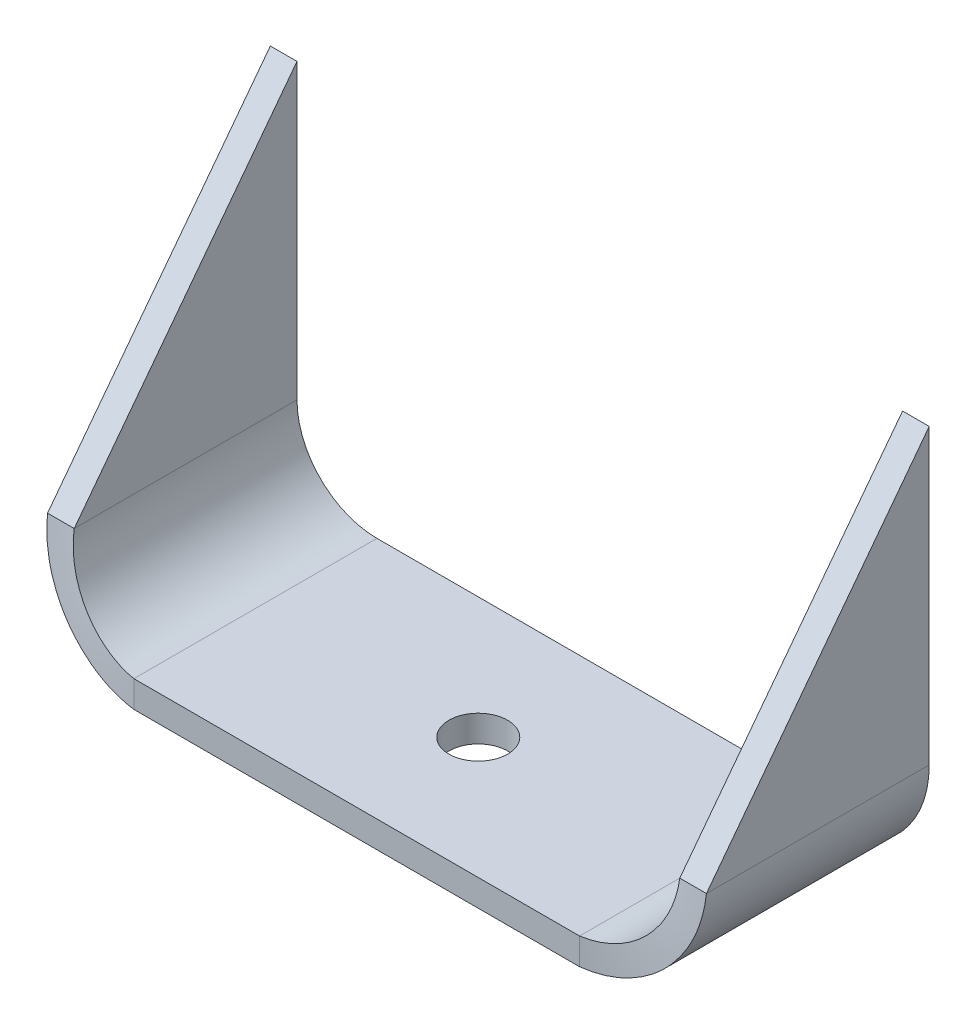
ISO-10303-21;
HEADER;
FILE_DESCRIPTION(('STEP AP214'),'2;1');
FILE_NAME('part.step','',(''),(''),'','','');
FILE_SCHEMA(('AUTOMOTIVE_DESIGN { 1 0 10303 214 1 1 1 1 }'));
ENDSEC;
DATA;
#1=APPLICATION_CONTEXT('core data for automotive mechanical design processes');
#2=APPLICATION_PROTOCOL_DEFINITION('international standard','automotive_design',2000,#1);
#3=PRODUCT_CONTEXT('',#1,'mechanical');
#4=PRODUCT('Part','Part','',(#3));
#5=PRODUCT_RELATED_PRODUCT_CATEGORY('part','',(#4));
#6=PRODUCT_DEFINITION_FORMATION('','',#4);
#7=PRODUCT_DEFINITION_CONTEXT('part definition',#1,'design');
#8=PRODUCT_DEFINITION('design','',#6,#7);
#9=PRODUCT_DEFINITION_SHAPE('','',#8);
#10=(LENGTH_UNIT() NAMED_UNIT(*) SI_UNIT(.MILLI.,.METRE.));
#11=(NAMED_UNIT(*) PLANE_ANGLE_UNIT() SI_UNIT($,.RADIAN.));
#12=(NAMED_UNIT(*) SI_UNIT($,.STERADIAN.) SOLID_ANGLE_UNIT());
#13=UNCERTAINTY_MEASURE_WITH_UNIT(LENGTH_MEASURE(1.E-05),#10,'distance_accuracy_value','');
#14=(GEOMETRIC_REPRESENTATION_CONTEXT(3) GLOBAL_UNCERTAINTY_ASSIGNED_CONTEXT((#13)) GLOBAL_UNIT_ASSIGNED_CONTEXT((#10,
#11,#12)) REPRESENTATION_CONTEXT('',''));
#15=CARTESIAN_POINT('',(0.,0.,0.));
#16=DIRECTION('',(0.,0.,1.));
#17=DIRECTION('',(1.,0.,0.));
#18=AXIS2_PLACEMENT_3D('',#15,#16,#17);
#19=CARTESIAN_POINT('',(0.,-3.175,-28.956));
#20=DIRECTION('',(0.,0.,-1.));
#21=DIRECTION('',(-1.,0.,0.));
#22=AXIS2_PLACEMENT_3D('',#19,#20,#21);
#23=PLANE('',#22);
#24=DIRECTION('',(-1.,0.,0.));
#25=VECTOR('',#24,1.);
#26=CARTESIAN_POINT('',(0.,0.,-28.956));
#27=LINE('',#26,#25);
#28=CARTESIAN_POINT('',(53.099999972,0.,-28.956));
#29=VERTEX_POINT('',#28);
#30=CARTESIAN_POINT('',(0.,0.,-28.956));
#31=VERTEX_POINT('',#30);
#32=EDGE_CURVE('E113',#29,#31,#27,.T.);
#33=ORIENTED_EDGE('',*,*,#32,.F.);
#34=DIRECTION('',(0.,1.,0.));
#35=VECTOR('',#34,1.);
#36=CARTESIAN_POINT('',(53.099999972,-3.175,-28.956));
#37=LINE('',#36,#35);
#38=CARTESIAN_POINT('',(53.099999972,-3.175,-28.956));
#39=VERTEX_POINT('',#38);
#40=EDGE_CURVE('E81',#39,#29,#37,.T.);
#41=ORIENTED_EDGE('',*,*,#40,.F.);
#42=DIRECTION('',(-1.,0.,0.));
#43=VECTOR('',#42,1.);
#44=CARTESIAN_POINT('',(0.,-3.175,-28.956));
#45=LINE('',#44,#43);
#46=CARTESIAN_POINT('',(0.,-3.175,-28.956));
#47=VERTEX_POINT('',#46);
#48=EDGE_CURVE('E115',#39,#47,#45,.T.);
#49=ORIENTED_EDGE('',*,*,#48,.T.);
#50=DIRECTION('',(0.,1.,0.));
#51=VECTOR('',#50,1.);
#52=CARTESIAN_POINT('',(0.,-3.175,-28.956));
#53=LINE('',#52,#51);
#54=EDGE_CURVE('E13',#47,#31,#53,.T.);
#55=ORIENTED_EDGE('',*,*,#54,.T.);
#56=EDGE_LOOP('',(#33,#41,#49,#55));
#57=FACE_BOUND('',#56,.T.);
#58=ADVANCED_FACE('F71',(#57),#23,.T.);
#59=CARTESIAN_POINT('',(0.,-3.175,0.));
#60=DIRECTION('',(0.,0.,1.));
#61=DIRECTION('',(1.,0.,0.));
#62=AXIS2_PLACEMENT_3D('',#59,#60,#61);
#63=PLANE('',#62);
#64=DIRECTION('',(1.,0.,0.));
#65=VECTOR('',#64,1.);
#66=CARTESIAN_POINT('',(0.,0.,0.));
#67=LINE('',#66,#65);
#68=CARTESIAN_POINT('',(0.,0.,0.));
#69=VERTEX_POINT('',#68);
#70=CARTESIAN_POINT('',(53.099999972,0.,0.));
#71=VERTEX_POINT('',#70);
#72=EDGE_CURVE('E136',#69,#71,#67,.T.);
#73=ORIENTED_EDGE('',*,*,#72,.F.);
#74=DIRECTION('',(0.,1.,0.));
#75=VECTOR('',#74,1.);
#76=CARTESIAN_POINT('',(0.,-3.175,0.));
#77=LINE('',#76,#75);
#78=CARTESIAN_POINT('',(0.,-3.175,0.));
#79=VERTEX_POINT('',#78);
#80=EDGE_CURVE('E75',#79,#69,#77,.T.);
#81=ORIENTED_EDGE('',*,*,#80,.F.);
#82=DIRECTION('',(1.,0.,0.));
#83=VECTOR('',#82,1.);
#84=CARTESIAN_POINT('',(0.,-3.175,0.));
#85=LINE('',#84,#83);
#86=CARTESIAN_POINT('',(53.099999972,-3.175,0.));
#87=VERTEX_POINT('',#86);
#88=EDGE_CURVE('E240',#79,#87,#85,.T.);
#89=ORIENTED_EDGE('',*,*,#88,.T.);
#90=DIRECTION('',(0.,1.,0.));
#91=VECTOR('',#90,1.);
#92=CARTESIAN_POINT('',(53.099999972,-3.175,0.));
#93=LINE('',#92,#91);
#94=EDGE_CURVE('E249',#87,#71,#93,.T.);
#95=ORIENTED_EDGE('',*,*,#94,.T.);
#96=EDGE_LOOP('',(#73,#81,#89,#95));
#97=FACE_BOUND('',#96,.T.);
#98=ADVANCED_FACE('F73',(#97),#63,.T.);
#99=CARTESIAN_POINT('',(0.,-3.175,0.));
#100=DIRECTION('',(0.,-1.,0.));
#101=DIRECTION('',(0.,0.,-1.));
#102=AXIS2_PLACEMENT_3D('',#99,#100,#101);
#103=PLANE('',#102);
#104=CARTESIAN_POINT('',(26.549999986,-3.175,-14.478));
#105=DIRECTION('',(0.,1.,0.));
#106=DIRECTION('',(0.,0.,1.));
#107=AXIS2_PLACEMENT_3D('',#104,#105,#106);
#108=CIRCLE('',#107,3.5);
#109=CARTESIAN_POINT('',(26.549999986,-3.175,-10.978));
#110=VERTEX_POINT('',#109);
#111=EDGE_CURVE('E374',#110,#110,#108,.T.);
#112=ORIENTED_EDGE('',*,*,#111,.T.);
#113=EDGE_LOOP('',(#112));
#114=FACE_BOUND('',#113,.T.);
#115=DIRECTION('',(0.,0.,1.));
#116=VECTOR('',#115,1.);
#117=CARTESIAN_POINT('',(0.,-3.175,0.));
#118=LINE('',#117,#116);
#119=EDGE_CURVE('E90',#47,#79,#118,.T.);
#120=ORIENTED_EDGE('',*,*,#119,.F.);
#121=ORIENTED_EDGE('',*,*,#48,.F.);
#122=DIRECTION('',(0.,0.,-1.));
#123=VECTOR('',#122,1.);
#124=CARTESIAN_POINT('',(53.099999972,-3.175,0.));
#125=LINE('',#124,#123);
#126=EDGE_CURVE('E243',#87,#39,#125,.T.);
#127=ORIENTED_EDGE('',*,*,#126,.F.);
#128=ORIENTED_EDGE('',*,*,#88,.F.);
#129=EDGE_LOOP('',(#120,#121,#127,#128));
#130=FACE_BOUND('',#129,.T.);
#131=ADVANCED_FACE('F193',(#114,#130),#103,.T.);
#132=CARTESIAN_POINT('',(0.,0.,0.));
#133=DIRECTION('',(0.,-1.,0.));
#134=DIRECTION('',(0.,0.,-1.));
#135=AXIS2_PLACEMENT_3D('',#132,#133,#134);
#136=PLANE('',#135);
#137=CARTESIAN_POINT('',(26.549999986,0.,-14.478));
#138=DIRECTION('',(0.,1.,0.));
#139=DIRECTION('',(0.,0.,1.));
#140=AXIS2_PLACEMENT_3D('',#137,#138,#139);
#141=CIRCLE('',#140,3.49999999999999);
#142=CARTESIAN_POINT('',(26.549999986,0.,-10.978));
#143=VERTEX_POINT('',#142);
#144=EDGE_CURVE('E376',#143,#143,#141,.T.);
#145=ORIENTED_EDGE('',*,*,#144,.F.);
#146=EDGE_LOOP('',(#145));
#147=FACE_BOUND('',#146,.T.);
#148=DIRECTION('',(0.,0.,1.));
#149=VECTOR('',#148,1.);
#150=CARTESIAN_POINT('',(0.,0.,0.));
#151=LINE('',#150,#149);
#152=EDGE_CURVE('E123',#31,#69,#151,.T.);
#153=ORIENTED_EDGE('',*,*,#152,.T.);
#154=ORIENTED_EDGE('',*,*,#72,.T.);
#155=DIRECTION('',(0.,0.,-1.));
#156=VECTOR('',#155,1.);
#157=CARTESIAN_POINT('',(53.099999972,0.,0.));
#158=LINE('',#157,#156);
#159=EDGE_CURVE('E108',#71,#29,#158,.T.);
#160=ORIENTED_EDGE('',*,*,#159,.T.);
#161=ORIENTED_EDGE('',*,*,#32,.T.);
#162=EDGE_LOOP('',(#153,#154,#160,#161));
#163=FACE_BOUND('',#162,.T.);
#164=ADVANCED_FACE('F122',(#147,#163),#136,.F.);
#165=CARTESIAN_POINT('',(53.099999972,-3.20675,0.));
#166=CARTESIAN_POINT('',(54.7668783217408,-3.20675,-0.201119069286974));
#167=CARTESIAN_POINT('',(56.4325085986912,-2.87537662617183,-0.402166666666662));
#168=CARTESIAN_POINT('',(59.5119509253372,-1.59982984992933,-0.804333333333324));
#169=CARTESIAN_POINT('',(60.9242551740406,-0.656158320703046,-1.00541666666665));
#170=CARTESIAN_POINT('',(63.281158292703,1.70074479795935,-1.40758333333332));
#171=CARTESIAN_POINT('',(64.2248298219293,3.11304904666277,-1.60866666666665));
#172=CARTESIAN_POINT('',(65.5003765981718,6.1924913733087,-2.01083333333331));
#173=CARTESIAN_POINT('',(65.831749972,7.85812165025914,-2.211880930713));
#174=CARTESIAN_POINT('',(65.831749972,9.52499999999995,-2.41299999999997));
#175=CARTESIAN_POINT('',(53.099999972,-3.175,0.));
#176=CARTESIAN_POINT('',(54.7627214933645,-3.175,-0.201119065323934));
#177=CARTESIAN_POINT('',(56.4241981033628,-2.84445299368761,-0.402166666666662));
#178=CARTESIAN_POINT('',(59.4959610227104,-1.57208713209909,-0.804333333333324));
#179=CARTESIAN_POINT('',(60.9047433156814,-0.630768898456903,-1.00541666666665));
#180=CARTESIAN_POINT('',(63.2557688704569,1.72025665631856,-1.40758333333332));
#181=CARTESIAN_POINT('',(64.1970871040991,3.12903894928955,-1.60866666666665));
#182=CARTESIAN_POINT('',(65.4694529656876,6.2008018686371,-2.01083333333331));
#183=CARTESIAN_POINT('',(65.799999972,7.86227847863543,-2.21188093467604));
#184=CARTESIAN_POINT('',(65.799999972,9.52499999999995,-2.41299999999997));
#185=CARTESIAN_POINT('',(53.099999972,0.,0.));
#186=CARTESIAN_POINT('',(54.3470386557356,0.,-0.201118669019911));
#187=CARTESIAN_POINT('',(55.5931485705221,0.247910254734289,-0.402166666666662));
#188=CARTESIAN_POINT('',(57.8969707600328,1.20218465092568,-0.804333333333324));
#189=CARTESIAN_POINT('',(58.953557479761,1.90817332615732,-1.00541666666665));
#190=CARTESIAN_POINT('',(60.7168266458427,3.67144249223892,-1.40758333333332));
#191=CARTESIAN_POINT('',(61.4228153210743,4.72802921196716,-1.60866666666665));
#192=CARTESIAN_POINT('',(62.3770897172657,7.03185140147783,-2.01083333333331));
#193=CARTESIAN_POINT('',(62.624999972,8.27796131626434,-2.21188133098006));
#194=CARTESIAN_POINT('',(62.624999972,9.52499999999996,-2.41299999999997));
#195=CARTESIAN_POINT('',(53.099999972,0.0320674999999965,0.));
#196=CARTESIAN_POINT('',(54.3428402590756,0.0320674999999964,-0.20111866501724));
#197=CARTESIAN_POINT('',(55.5847549702404,0.27914312354335,-0.402166666666662));
#198=CARTESIAN_POINT('',(57.8808209583798,1.23020479593423,-0.804333333333324));
#199=CARTESIAN_POINT('',(58.9338505028182,1.93381664262592,-1.00541666666665));
#200=CARTESIAN_POINT('',(60.691183329374,3.69114946918171,-1.40758333333332));
#201=CARTESIAN_POINT('',(61.3947951760657,4.7441790136202,-1.60866666666665));
#202=CARTESIAN_POINT('',(62.3458568484566,7.04024500175952,-2.01083333333331));
#203=CARTESIAN_POINT('',(62.592932472,8.2821597129244,-2.21188133498273));
#204=CARTESIAN_POINT('',(62.592932472,9.52499999999996,-2.41299999999997));
#205=B_SPLINE_SURFACE_WITH_KNOTS('',1,3,((#165,#166,#167,#168,#169,#170,#171,#172,#173,#174),
(#175,#176,#177,#178,#179,#180,#181,#182,#183,#184),(#185,#186,#187,#188,#189,#190,#191,#192,
#193,#194),(#195,#196,#197,#198,#199,#200,#201,#202,#203,#204)),.UNSPECIFIED.,.F.,.F.,.F.,(2,1,
1,2),(4,2,2,2,4),(-0.01,0.,1.,1.0101),(0.,0.25,0.5,0.75,1.),.UNSPECIFIED.);
#206=DIRECTION('',(-1.,0.,0.));
#207=VECTOR('',#206,1.);
#208=CARTESIAN_POINT('',(65.799999972,9.52499999999995,-2.41299999999997));
#209=LINE('',#208,#207);
#210=CARTESIAN_POINT('',(62.624999972,9.52499999999996,-2.41299999999997));
#211=VERTEX_POINT('',#210);
#212=CARTESIAN_POINT('',(65.799999972,9.52499999999995,-2.41299999999997));
#213=VERTEX_POINT('',#212);
#214=EDGE_CURVE('E264',#211,#213,#209,.F.);
#215=CARTESIAN_POINT('',(53.099999972,0.,0.));
#216=CARTESIAN_POINT('',(53.3712999926333,-3.0282621135614E-05,-0.0437561906853781));
#217=CARTESIAN_POINT('',(53.6425957263183,0.0115898621989685,-0.0875116631499076));
#218=CARTESIAN_POINT('',(54.1831968820804,0.0579122984946413,-0.175018553010706));
#219=CARTESIAN_POINT('',(54.4525024019455,0.0926134481698858,-0.218769970500498));
#220=CARTESIAN_POINT('',(54.9869648919899,0.184844068995432,-0.306237119437251));
#221=CARTESIAN_POINT('',(55.2521248673012,0.242356122931786,-0.349952852670426));
#222=CARTESIAN_POINT('',(55.7765711009828,0.379779250222863,-0.437387746101037));
#223=CARTESIAN_POINT('',(56.0358574309864,0.459690050249545,-0.481106906250145));
#224=CARTESIAN_POINT('',(56.5468770506072,0.641404694150914,-0.568580273035358));
#225=CARTESIAN_POINT('',(56.7986040926012,0.74322610850805,-0.612334479555428));
#226=CARTESIAN_POINT('',(57.2924552186447,0.967982640005884,-0.699844670147483));
#227=CARTESIAN_POINT('',(57.5345790984543,1.09091820590589,-0.743600654237484));
#228=CARTESIAN_POINT('',(58.0074048134801,1.35697844705272,-0.83109966178345));
#229=CARTESIAN_POINT('',(58.2381089259176,1.50009907509738,-0.8748426860803));
#230=CARTESIAN_POINT('',(58.6864622642934,1.80550282319842,-0.962329254284162));
#231=CARTESIAN_POINT('',(58.9041115647686,1.96778583383073,-1.00607279818678));
#232=CARTESIAN_POINT('',(59.3247646299521,2.31032748420228,-1.09356264291077));
#233=CARTESIAN_POINT('',(59.5277686900167,2.49058576125258,-1.13730894365873));
#234=CARTESIAN_POINT('',(59.9176560486485,2.86776634636902,-1.22480070751386));
#235=CARTESIAN_POINT('',(60.1045393462315,3.06468865545261,-1.26854617062099));
#236=CARTESIAN_POINT('',(60.4608662614792,3.4738118292412,-1.35604708889815));
#237=CARTESIAN_POINT('',(60.6303055479476,3.6860164662941,-1.39980254385926));
#238=CARTESIAN_POINT('',(60.9504524085507,4.12410884752804,-1.48730929233299));
#239=CARTESIAN_POINT('',(61.1011603185169,4.34999634628343,-1.53106058590616));
#240=CARTESIAN_POINT('',(61.3827851876533,4.81387109680399,-1.61857832421223));
#241=CARTESIAN_POINT('',(61.5136968733552,5.05186155016321,-1.66234476988032));
#242=CARTESIAN_POINT('',(61.7547234026754,5.53814274245009,-1.74987732517462));
#243=CARTESIAN_POINT('',(61.8648386272968,5.78643329257242,-1.79364343479229));
#244=CARTESIAN_POINT('',(62.0634138766957,6.29136754157777,-1.88115198038449));
#245=CARTESIAN_POINT('',(62.1518865229127,6.54800627257886,-1.92489441524196));
#246=CARTESIAN_POINT('',(62.3065907774417,7.06779602997821,-2.01235885457143));
#247=CARTESIAN_POINT('',(62.3728286609904,7.33094519641041,-2.05608086132424));
#248=CARTESIAN_POINT('',(62.4933026484582,7.91369110863582,-2.15204751998587));
#249=CARTESIAN_POINT('',(62.5426976542474,8.23431074710971,-2.20429559706653));
#250=CARTESIAN_POINT('',(62.5920784639714,8.71736848912778,-2.28260829288259));
#251=CARTESIAN_POINT('',(62.6044201066049,8.87863958216343,-2.3086861150697));
#252=CARTESIAN_POINT('',(62.6208803140551,9.20159664576877,-2.36084114049977));
#253=CARTESIAN_POINT('',(62.6249990951739,9.36328260531338,-2.38691834374096));
#254=CARTESIAN_POINT('',(62.624999972,9.52499999999996,-2.41299999999997));
#255=B_SPLINE_CURVE_WITH_KNOTS('',3,(#215,#216,#217,#218,#219,#220,#221,#222,#223,#224,#225,
#226,#227,#228,#229,#230,#231,#232,#233,#234,#235,#236,#237,#238,#239,#240,#241,#242,#243,#244,
#245,#246,#247,#248,#249,#250,#251,#252,#253,#254),.UNSPECIFIED.,.F.,.F.,(4,2,2,2,2,2,2,2,2,2,2,
2,2,2,2,2,2,2,2,4),(0.,0.8241661277999,1.64829148774001,2.47178879629985,3.29527605630133,
4.11942616173549,4.94359378579012,5.76759639457741,6.59159429824171,7.41557557937188,
8.23955691081138,9.06374233873039,9.88791298784274,10.7123028004835,11.5366775083655,
12.360570308149,13.1842303877653,14.1681132071005,14.6594323230379,15.1507385146688),.UNSPECIFIED.);
#256=EDGE_CURVE('E230',#71,#211,#255,.T.);
#257=CARTESIAN_POINT('',(53.099999972,-3.175,0.));
#258=CARTESIAN_POINT('',(53.4598143696205,-3.1750395351196,-0.0435240480951579));
#259=CARTESIAN_POINT('',(53.8196231332415,-3.15971035290083,-0.0870474138938615));
#260=CARTESIAN_POINT('',(54.5366287845854,-3.09860008956019,-0.174090143467927));
#261=CARTESIAN_POINT('',(54.8938257986772,-3.05282049176502,-0.217609507334962));
#262=CARTESIAN_POINT('',(55.6027731264167,-2.9311411835604,-0.304612728824404));
#263=CARTESIAN_POINT('',(55.9545273769736,-2.85526441386736,-0.348096588271414));
#264=CARTESIAN_POINT('',(56.6503276354568,-2.67395102423988,-0.435067694486709));
#265=CARTESIAN_POINT('',(56.9943737385714,-2.56851476955439,-0.478554941206503));
#266=CARTESIAN_POINT('',(57.6724578369761,-2.32877656292204,-0.565551817437175));
#267=CARTESIAN_POINT('',(58.0064905683299,-2.19445972173802,-0.609061446901118));
#268=CARTESIAN_POINT('',(58.6619519097978,-1.89796259982687,-0.69608163733563));
#269=CARTESIAN_POINT('',(58.9833805170782,-1.73578231283558,-0.739592198306405));
#270=CARTESIAN_POINT('',(59.6112573413644,-1.38476010213809,-0.826601186653028));
#271=CARTESIAN_POINT('',(59.9177082890723,-1.19592306304156,-0.870099614792185));
#272=CARTESIAN_POINT('',(60.5134802550246,-0.792928403435308,-0.957096717161467));
#273=CARTESIAN_POINT('',(60.8028013682555,-0.578770923349396,-1.00059539138889));
#274=CARTESIAN_POINT('',(61.3622236320287,-0.126683385581436,-1.08759582039746));
#275=CARTESIAN_POINT('',(61.6323251135153,0.111246262596263,-1.13109757511264));
#276=CARTESIAN_POINT('',(62.1513674544664,0.609166897942846,-1.21810040396436));
#277=CARTESIAN_POINT('',(62.4003081928641,0.869158011314824,-1.26160147809559));
#278=CARTESIAN_POINT('',(62.8752854330261,1.4093863067857,-1.34861294408476));
#279=CARTESIAN_POINT('',(63.1013167547393,1.68962804332754,-1.3921233358307));
#280=CARTESIAN_POINT('',(63.5287767086809,2.26827870266163,-1.47913974736263));
#281=CARTESIAN_POINT('',(63.7302057549113,2.56668731961873,-1.52264576720986));
#282=CARTESIAN_POINT('',(64.107055529204,3.17959433905747,-1.60967107411692));
#283=CARTESIAN_POINT('',(64.2824702172968,3.49409645537308,-1.65319036191434));
#284=CARTESIAN_POINT('',(64.6059696105987,4.13685386284893,-1.74022997698844));
#285=CARTESIAN_POINT('',(64.7540542246498,4.46510919987781,-1.7837503042681));
#286=CARTESIAN_POINT('',(65.0217525277857,5.13283634639929,-1.87076939988641));
#287=CARTESIAN_POINT('',(65.1413815473333,5.4723020035453,-1.91426816717695));
#288=CARTESIAN_POINT('',(65.3513774326387,6.16002596319479,-2.00124576890148));
#289=CARTESIAN_POINT('',(65.4417520269375,6.50828191719467,-2.04472460556485));
#290=CARTESIAN_POINT('',(65.6111751025034,7.29769961753033,-2.14238100576527));
#291=CARTESIAN_POINT('',(65.6819907098931,7.74067267066972,-2.19656359108586));
#292=CARTESIAN_POINT('',(65.7527923609981,8.40833184343949,-2.27777531169699));
#293=CARTESIAN_POINT('',(65.7704892688882,8.63128741182623,-2.3048197959303));
#294=CARTESIAN_POINT('',(65.7940920280174,9.07781259387584,-2.35890777633193));
#295=CARTESIAN_POINT('',(65.7999983673479,9.30138218173662,-2.38595127249479));
#296=CARTESIAN_POINT('',(65.799999972,9.52499999999995,-2.41299999999997));
#297=B_SPLINE_CURVE_WITH_KNOTS('',3,(#257,#258,#259,#260,#261,#262,#263,#264,#265,#266,#267,
#268,#269,#270,#271,#272,#273,#274,#275,#276,#277,#278,#279,#280,#281,#282,#283,#284,#285,#286,
#287,#288,#289,#290,#291,#292,#293,#294,#295,#296),.UNSPECIFIED.,.F.,.F.,(4,2,2,2,2,2,2,2,2,2,2,
2,2,2,2,2,2,2,2,4),(0.,1.08697965280844,2.17390635961131,3.26000617445681,4.34609256960571,
5.43274023928401,6.51938815325865,7.60583720664282,8.69228023500694,9.77870455130149,
10.865135082929,11.9518107220374,13.0384680722732,14.1253773270917,15.2122902071711,
16.2986161794498,17.384654927501,18.7374217285285,19.4130187958131,20.0885878949887),.UNSPECIFIED.);
#298=EDGE_CURVE('E137',#87,#213,#297,.T.);
#299=ORIENTED_EDGE('',*,*,#214,.F.);
#300=ORIENTED_EDGE('',*,*,#256,.F.);
#301=ORIENTED_EDGE('',*,*,#94,.F.);
#302=ORIENTED_EDGE('',*,*,#298,.T.);
#303=EDGE_LOOP('',(#299,#300,#301,#302));
#304=FACE_BOUND('',#303,.T.);
#305=ADVANCED_FACE('F198',(#304),#205,.F.);
#306=CARTESIAN_POINT('',(53.099999972,9.525,-28.956));
#307=DIRECTION('',(0.,0.,1.));
#308=DIRECTION('',(1.,0.,0.));
#309=AXIS2_PLACEMENT_3D('',#306,#307,#308);
#310=PLANE('',#309);
#311=CARTESIAN_POINT('',(53.099999972,9.525,-28.956));
#312=DIRECTION('',(0.,0.,-1.));
#313=DIRECTION('',(-1.,0.,0.));
#314=AXIS2_PLACEMENT_3D('',#311,#312,#313);
#315=CIRCLE('',#314,9.525);
#316=CARTESIAN_POINT('',(62.624999972,9.52499999999996,-28.956));
#317=VERTEX_POINT('',#316);
#318=EDGE_CURVE('E238',#317,#29,#315,.T.);
#319=ORIENTED_EDGE('',*,*,#318,.F.);
#320=DIRECTION('',(-1.,0.,0.));
#321=VECTOR('',#320,1.);
#322=CARTESIAN_POINT('',(62.624999972,9.52499999999996,-28.956));
#323=LINE('',#322,#321);
#324=CARTESIAN_POINT('',(65.799999972,9.52499999999995,-28.956));
#325=VERTEX_POINT('',#324);
#326=EDGE_CURVE('E275',#317,#325,#323,.F.);
#327=ORIENTED_EDGE('',*,*,#326,.T.);
#328=CARTESIAN_POINT('',(53.099999972,9.525,-28.956));
#329=DIRECTION('',(0.,0.,-1.));
#330=DIRECTION('',(-1.,0.,0.));
#331=AXIS2_PLACEMENT_3D('',#328,#329,#330);
#332=CIRCLE('',#331,12.7);
#333=EDGE_CURVE('E237',#325,#39,#332,.T.);
#334=ORIENTED_EDGE('',*,*,#333,.T.);
#335=ORIENTED_EDGE('',*,*,#40,.T.);
#336=EDGE_LOOP('',(#319,#327,#334,#335));
#337=FACE_BOUND('',#336,.T.);
#338=ADVANCED_FACE('F203',(#337),#310,.F.);
#339=CARTESIAN_POINT('',(53.099999972,9.525,-28.956));
#340=DIRECTION('',(0.,0.,-1.));
#341=DIRECTION('',(1.,0.,0.));
#342=AXIS2_PLACEMENT_3D('',#339,#340,#341);
#343=CYLINDRICAL_SURFACE('',#342,12.7);
#344=ORIENTED_EDGE('',*,*,#126,.T.);
#345=ORIENTED_EDGE('',*,*,#333,.F.);
#346=DIRECTION('',(0.,0.,-1.));
#347=VECTOR('',#346,1.);
#348=CARTESIAN_POINT('',(65.799999972,9.52499999999995,-2.41299999999997));
#349=LINE('',#348,#347);
#350=EDGE_CURVE('E299',#325,#213,#349,.F.);
#351=ORIENTED_EDGE('',*,*,#350,.T.);
#352=ORIENTED_EDGE('',*,*,#298,.F.);
#353=EDGE_LOOP('',(#344,#345,#351,#352));
#354=FACE_BOUND('',#353,.T.);
#355=ADVANCED_FACE('F206',(#354),#343,.T.);
#356=CARTESIAN_POINT('',(53.099999972,9.525,-28.956));
#357=DIRECTION('',(0.,0.,-1.));
#358=DIRECTION('',(1.,0.,0.));
#359=AXIS2_PLACEMENT_3D('',#356,#357,#358);
#360=CYLINDRICAL_SURFACE('',#359,9.525);
#361=ORIENTED_EDGE('',*,*,#159,.F.);
#362=ORIENTED_EDGE('',*,*,#256,.T.);
#363=DIRECTION('',(0.,0.,-1.));
#364=VECTOR('',#363,1.);
#365=CARTESIAN_POINT('',(62.624999972,9.52499999999996,-2.41299999999997));
#366=LINE('',#365,#364);
#367=EDGE_CURVE('E266',#211,#317,#366,.T.);
#368=ORIENTED_EDGE('',*,*,#367,.T.);
#369=ORIENTED_EDGE('',*,*,#318,.T.);
#370=EDGE_LOOP('',(#361,#362,#368,#369));
#371=FACE_BOUND('',#370,.T.);
#372=ADVANCED_FACE('F214',(#371),#360,.F.);
#373=CARTESIAN_POINT('',(65.7999999720001,44.45,-28.956));
#374=DIRECTION('',(0.,0.,1.));
#375=DIRECTION('',(0.,-1.,0.));
#376=AXIS2_PLACEMENT_3D('',#373,#374,#375);
#377=PLANE('',#376);
#378=ORIENTED_EDGE('',*,*,#326,.F.);
#379=DIRECTION('',(0.,-1.,0.));
#380=VECTOR('',#379,1.);
#381=CARTESIAN_POINT('',(62.6249999720001,44.45,-28.956));
#382=LINE('',#381,#380);
#383=CARTESIAN_POINT('',(62.6249999720001,44.45,-28.956));
#384=VERTEX_POINT('',#383);
#385=EDGE_CURVE('E296',#317,#384,#382,.F.);
#386=ORIENTED_EDGE('',*,*,#385,.T.);
#387=DIRECTION('',(-1.,0.,0.));
#388=VECTOR('',#387,1.);
#389=CARTESIAN_POINT('',(65.7999999720001,44.45,-28.956));
#390=LINE('',#389,#388);
#391=CARTESIAN_POINT('',(65.7999999720001,44.45,-28.956));
#392=VERTEX_POINT('',#391);
#393=EDGE_CURVE('E281',#392,#384,#390,.T.);
#394=ORIENTED_EDGE('',*,*,#393,.F.);
#395=DIRECTION('',(0.,1.,0.));
#396=VECTOR('',#395,1.);
#397=CARTESIAN_POINT('',(65.799999972,-1.82898710443765E-13,-28.956));
#398=LINE('',#397,#396);
#399=EDGE_CURVE('E289',#325,#392,#398,.T.);
#400=ORIENTED_EDGE('',*,*,#399,.F.);
#401=EDGE_LOOP('',(#378,#386,#394,#400));
#402=FACE_BOUND('',#401,.T.);
#403=ADVANCED_FACE('F315',(#402),#377,.F.);
#404=CARTESIAN_POINT('',(65.799999972,6.34999999999999,0.));
#405=DIRECTION('',(0.,-0.605083267533558,-0.796162194123103));
#406=DIRECTION('',(0.,0.796162194123103,-0.605083267533558));
#407=AXIS2_PLACEMENT_3D('',#404,#405,#406);
#408=PLANE('',#407);
#409=ORIENTED_EDGE('',*,*,#214,.T.);
#410=DIRECTION('',(0.,-0.796162194123103,0.605083267533558));
#411=VECTOR('',#410,1.);
#412=CARTESIAN_POINT('',(65.799999972,2.32489858012158,3.05907707910759));
#413=LINE('',#412,#411);
#414=EDGE_CURVE('E285',#392,#213,#413,.T.);
#415=ORIENTED_EDGE('',*,*,#414,.F.);
#416=ORIENTED_EDGE('',*,*,#393,.T.);
#417=DIRECTION('',(0.,0.796162194123103,-0.605083267533558));
#418=VECTOR('',#417,1.);
#419=CARTESIAN_POINT('',(62.624999972,6.35,0.));
#420=LINE('',#419,#418);
#421=EDGE_CURVE('E294',#384,#211,#420,.F.);
#422=ORIENTED_EDGE('',*,*,#421,.T.);
#423=EDGE_LOOP('',(#409,#415,#416,#422));
#424=FACE_BOUND('',#423,.T.);
#425=ADVANCED_FACE('F318',(#424),#408,.F.);
#426=CARTESIAN_POINT('',(65.799999972,-1.85158807315324E-13,0.));
#427=DIRECTION('',(-1.,0.,0.));
#428=DIRECTION('',(0.,-1.,0.));
#429=AXIS2_PLACEMENT_3D('',#426,#427,#428);
#430=PLANE('',#429);
#431=ORIENTED_EDGE('',*,*,#350,.F.);
#432=ORIENTED_EDGE('',*,*,#399,.T.);
#433=ORIENTED_EDGE('',*,*,#414,.T.);
#434=EDGE_LOOP('',(#431,#432,#433));
#435=FACE_BOUND('',#434,.T.);
#436=ADVANCED_FACE('F186',(#435),#430,.F.);
#437=CARTESIAN_POINT('',(62.624999972,-1.74073354064497E-13,0.));
#438=DIRECTION('',(-1.,0.,0.));
#439=DIRECTION('',(0.,-1.,0.));
#440=AXIS2_PLACEMENT_3D('',#437,#438,#439);
#441=PLANE('',#440);
#442=ORIENTED_EDGE('',*,*,#385,.F.);
#443=ORIENTED_EDGE('',*,*,#367,.F.);
#444=ORIENTED_EDGE('',*,*,#421,.F.);
#445=EDGE_LOOP('',(#442,#443,#444));
#446=FACE_BOUND('',#445,.T.);
#447=ADVANCED_FACE('F180',(#446),#441,.T.);
#448=CARTESIAN_POINT('',(0.,9.525,-28.956));
#449=DIRECTION('',(0.,0.,-1.));
#450=DIRECTION('',(0.,1.,0.));
#451=AXIS2_PLACEMENT_3D('',#448,#449,#450);
#452=PLANE('',#451);
#453=DIRECTION('',(1.,0.,0.));
#454=VECTOR('',#453,1.);
#455=CARTESIAN_POINT('',(-12.7,9.52499999999996,-28.956));
#456=LINE('',#455,#454);
#457=CARTESIAN_POINT('',(-9.525,9.52499999999997,-28.956));
#458=VERTEX_POINT('',#457);
#459=CARTESIAN_POINT('',(-12.7,9.52499999999996,-28.956));
#460=VERTEX_POINT('',#459);
#461=EDGE_CURVE('E142',#458,#460,#456,.F.);
#462=ORIENTED_EDGE('',*,*,#461,.F.);
#463=CARTESIAN_POINT('',(0.,9.525,-28.956));
#464=DIRECTION('',(0.,0.,1.));
#465=DIRECTION('',(0.,-1.,0.));
#466=AXIS2_PLACEMENT_3D('',#463,#464,#465);
#467=CIRCLE('',#466,9.525);
#468=EDGE_CURVE('E132',#31,#458,#467,.F.);
#469=ORIENTED_EDGE('',*,*,#468,.F.);
#470=ORIENTED_EDGE('',*,*,#54,.F.);
#471=CARTESIAN_POINT('',(0.,9.525,-28.956));
#472=DIRECTION('',(0.,0.,1.));
#473=DIRECTION('',(0.,-1.,0.));
#474=AXIS2_PLACEMENT_3D('',#471,#472,#473);
#475=CIRCLE('',#474,12.7);
#476=EDGE_CURVE('E146',#47,#460,#475,.F.);
#477=ORIENTED_EDGE('',*,*,#476,.T.);
#478=EDGE_LOOP('',(#462,#469,#470,#477));
#479=FACE_BOUND('',#478,.T.);
#480=ADVANCED_FACE('F140',(#479),#452,.T.);
#481=CARTESIAN_POINT('',(-12.73175,9.52499999999995,-2.4130000000001));
#482=CARTESIAN_POINT('',(-12.73175,7.85812165025913,-2.21188093071312));
#483=CARTESIAN_POINT('',(-12.4003766261718,6.19249137330869,-2.01083333333342));
#484=CARTESIAN_POINT('',(-11.1248298499293,3.11304904666277,-1.60866666666674));
#485=CARTESIAN_POINT('',(-10.181158320703,1.70074479795935,-1.40758333333339));
#486=CARTESIAN_POINT('',(-7.82425520204061,-0.656158320703043,-1.00541666666671));
#487=CARTESIAN_POINT('',(-6.41195095333718,-1.59982984992933,-0.804333333333367));
#488=CARTESIAN_POINT('',(-3.33250862669125,-2.87537662617183,-0.402166666666684));
#489=CARTESIAN_POINT('',(-1.66687834974082,-3.20675,-0.201119069286985));
#490=CARTESIAN_POINT('',(0.,-3.20675,0.));
#491=CARTESIAN_POINT('',(-12.7,9.52499999999995,-2.4130000000001));
#492=CARTESIAN_POINT('',(-12.7,7.86227847863542,-2.21188093467616));
#493=CARTESIAN_POINT('',(-12.3694529936876,6.2008018686371,-2.01083333333342));
#494=CARTESIAN_POINT('',(-11.0970871320991,3.12903894928955,-1.60866666666674));
#495=CARTESIAN_POINT('',(-10.1557688984569,1.72025665631856,-1.40758333333339));
#496=CARTESIAN_POINT('',(-7.8047433436814,-0.6307688984569,-1.00541666666671));
#497=CARTESIAN_POINT('',(-6.3959610507104,-1.57208713209908,-0.804333333333367));
#498=CARTESIAN_POINT('',(-3.32419813136285,-2.84445299368761,-0.402166666666684));
#499=CARTESIAN_POINT('',(-1.66272152136453,-3.175,-0.201119065323945));
#500=CARTESIAN_POINT('',(0.,-3.175,0.));
#501=CARTESIAN_POINT('',(-9.525,9.52499999999996,-2.4130000000001));
#502=CARTESIAN_POINT('',(-9.52499999999999,8.27796131626434,-2.21188133098018));
#503=CARTESIAN_POINT('',(-9.2770897452657,7.03185140147783,-2.01083333333342));
#504=CARTESIAN_POINT('',(-8.32281534907429,4.72802921196716,-1.60866666666673));
#505=CARTESIAN_POINT('',(-7.61682667384265,3.67144249223892,-1.40758333333339));
#506=CARTESIAN_POINT('',(-5.85355750776105,1.90817332615732,-1.00541666666671));
#507=CARTESIAN_POINT('',(-4.7969707880328,1.20218465092569,-0.804333333333367));
#508=CARTESIAN_POINT('',(-2.49314859852213,0.247910254734293,-0.402166666666683));
#509=CARTESIAN_POINT('',(-1.24703868373563,0.,-0.201118669019922));
#510=CARTESIAN_POINT('',(0.,0.,0.));
#511=CARTESIAN_POINT('',(-9.4929325,9.52499999999996,-2.4130000000001));
#512=CARTESIAN_POINT('',(-9.49293249999999,8.28215971292439,-2.21188133498285));
#513=CARTESIAN_POINT('',(-9.24585687645664,7.04024500175952,-2.01083333333342));
#514=CARTESIAN_POINT('',(-8.29479520406574,4.74417901362021,-1.60866666666673));
#515=CARTESIAN_POINT('',(-7.59118335737405,3.69114946918171,-1.40758333333339));
#516=CARTESIAN_POINT('',(-5.83385053081826,1.93381664262593,-1.00541666666671));
#517=CARTESIAN_POINT('',(-4.78082098637976,1.23020479593424,-0.804333333333367));
#518=CARTESIAN_POINT('',(-2.48475499824044,0.279143123543354,-0.402166666666683));
#519=CARTESIAN_POINT('',(-1.24284028707557,0.0320674999999999,-0.201118665017252));
#520=CARTESIAN_POINT('',(0.,0.0320675,0.));
#521=B_SPLINE_SURFACE_WITH_KNOTS('',1,3,((#481,#482,#483,#484,#485,#486,#487,#488,#489,#490),
(#491,#492,#493,#494,#495,#496,#497,#498,#499,#500),(#501,#502,#503,#504,#505,#506,#507,#508,
#509,#510),(#511,#512,#513,#514,#515,#516,#517,#518,#519,#520)),.UNSPECIFIED.,.F.,.F.,.F.,(2,1,
1,2),(4,2,2,2,4),(-0.01,0.,1.,1.0101),(0.,0.25,0.5,0.75,1.),.UNSPECIFIED.);
#522=CARTESIAN_POINT('',(-9.525,9.52499999999996,-2.4130000000001));
#523=CARTESIAN_POINT('',(-9.52503028262113,9.25369997936667,-2.36924380931472));
#524=CARTESIAN_POINT('',(-9.51341013780102,8.98240424568162,-2.32548833685019));
#525=CARTESIAN_POINT('',(-9.46708770150535,8.44180308991956,-2.23798144698939));
#526=CARTESIAN_POINT('',(-9.4323865518301,8.17249757005444,-2.19423002949959));
#527=CARTESIAN_POINT('',(-9.34015593100456,7.63803508001004,-2.10676288056284));
#528=CARTESIAN_POINT('',(-9.2826438770682,7.37287510469874,-2.06304714732966));
#529=CARTESIAN_POINT('',(-9.14522074977712,6.84842887101719,-1.97561225389904));
#530=CARTESIAN_POINT('',(-9.06530994975044,6.58914254101358,-1.93189309374993));
#531=CARTESIAN_POINT('',(-8.88359530584907,6.07812292139272,-1.84441972696471));
#532=CARTESIAN_POINT('',(-8.78177389149193,5.82639587939875,-1.80066552044464));
#533=CARTESIAN_POINT('',(-8.5570173599941,5.33254475335529,-1.71315532985258));
#534=CARTESIAN_POINT('',(-8.43408179409409,5.09042087354567,-1.66939934576258));
#535=CARTESIAN_POINT('',(-8.16802155294725,4.61759515851988,-1.58190033821661));
#536=CARTESIAN_POINT('',(-8.0249009249026,4.38689104608235,-1.53815731391975));
#537=CARTESIAN_POINT('',(-7.71949717680156,3.93853770770658,-1.45067074571589));
#538=CARTESIAN_POINT('',(-7.55721416616925,3.72088840723138,-1.40692720181327));
#539=CARTESIAN_POINT('',(-7.21467251579769,3.30023534204787,-1.31943735708927));
#540=CARTESIAN_POINT('',(-7.03441423874738,3.0972312819833,-1.27569105634131));
#541=CARTESIAN_POINT('',(-6.65723365363094,2.70734392335147,-1.18819929248617));
#542=CARTESIAN_POINT('',(-6.46031134454736,2.52046062576848,-1.14445382937905));
#543=CARTESIAN_POINT('',(-6.05118817075877,2.16413371052074,-1.05695291110188));
#544=CARTESIAN_POINT('',(-5.83898353370586,1.99469442405233,-1.01319745614077));
#545=CARTESIAN_POINT('',(-5.40089115247192,1.67454756344927,-0.92569070766703));
#546=CARTESIAN_POINT('',(-5.17500365371653,1.52383965348308,-0.881939414093854));
#547=CARTESIAN_POINT('',(-4.71112890319597,1.24221478434664,-0.794421675787778));
#548=CARTESIAN_POINT('',(-4.47313844983675,1.11130309864477,-0.750655230119687));
#549=CARTESIAN_POINT('',(-3.98685725754987,0.870276569324562,-0.663122674825386));
#550=CARTESIAN_POINT('',(-3.73856670742753,0.760161344703154,-0.619356565207711));
#551=CARTESIAN_POINT('',(-3.23363245842218,0.561586095304273,-0.531848019615505));
#552=CARTESIAN_POINT('',(-2.97699372742109,0.473113449087289,-0.488105584758032));
#553=CARTESIAN_POINT('',(-2.45720397002174,0.318409194558253,-0.400641145428561));
#554=CARTESIAN_POINT('',(-2.19405480358954,0.25217131100954,-0.356919138675746));
#555=CARTESIAN_POINT('',(-1.61130889136413,0.131697323541823,-0.260952480014116));
#556=CARTESIAN_POINT('',(-1.29068925289025,0.0823023177526384,-0.208704402933451));
#557=CARTESIAN_POINT('',(-0.807631510872179,0.0329215080286234,-0.130391707117391));
#558=CARTESIAN_POINT('',(-0.646360417836527,0.0205798653950852,-0.104313884930276));
#559=CARTESIAN_POINT('',(-0.32340335423119,0.00411965794488801,-0.0521588595002058));
#560=CARTESIAN_POINT('',(-0.161717394686586,8.76826077615967E-07,-0.0260816562590138));
#561=CARTESIAN_POINT('',(0.,0.,0.));
#562=B_SPLINE_CURVE_WITH_KNOTS('',3,(#522,#523,#524,#525,#526,#527,#528,#529,#530,#531,#532,
#533,#534,#535,#536,#537,#538,#539,#540,#541,#542,#543,#544,#545,#546,#547,#548,#549,#550,#551,
#552,#553,#554,#555,#556,#557,#558,#559,#560,#561),.UNSPECIFIED.,.F.,.F.,(4,2,2,2,2,2,2,2,2,2,2,
2,2,2,2,2,2,2,2,4),(0.,0.824166127799901,1.64829148774,2.47178879629985,3.29527605630133,
4.1194261617355,4.94359378579013,5.76759639457741,6.59159429824173,7.41557557937189,
8.23955691081139,9.06374233873041,9.88791298784275,10.7123028004835,11.5366775083655,
12.360570308149,13.1842303877654,14.1681132071005,14.6594323230379,15.1507385146688),.UNSPECIFIED.);
#563=CARTESIAN_POINT('',(-9.525,9.52499999999997,-2.4130000000001));
#564=VERTEX_POINT('',#563);
#565=EDGE_CURVE('E135',#564,#69,#562,.T.);
#566=DIRECTION('',(1.,0.,0.));
#567=VECTOR('',#566,1.);
#568=CARTESIAN_POINT('',(-9.525,9.52499999999996,-2.41300000000011));
#569=LINE('',#568,#567);
#570=CARTESIAN_POINT('',(-12.7,9.52499999999996,-2.41300000000011));
#571=VERTEX_POINT('',#570);
#572=EDGE_CURVE('E371',#564,#571,#569,.F.);
#573=CARTESIAN_POINT('',(-12.7,9.52499999999995,-2.4130000000001));
#574=CARTESIAN_POINT('',(-12.7000395351196,9.16518560237945,-2.36947595190494));
#575=CARTESIAN_POINT('',(-12.6847103529008,8.80537683875841,-2.32595258610624));
#576=CARTESIAN_POINT('',(-12.6236000895602,8.08837118741454,-2.23890985653217));
#577=CARTESIAN_POINT('',(-12.577820491765,7.73117417332277,-2.19539049266513));
#578=CARTESIAN_POINT('',(-12.4561411835604,7.02222684558328,-2.10838727117568));
#579=CARTESIAN_POINT('',(-12.3802644138673,6.67047259502637,-2.06490341172867));
#580=CARTESIAN_POINT('',(-12.1989510242399,5.97467233654314,-1.97793230551337));
#581=CARTESIAN_POINT('',(-12.0935147695544,5.63062623342856,-1.93444505879357));
#582=CARTESIAN_POINT('',(-11.853776562922,4.95254213502381,-1.8474481825629));
#583=CARTESIAN_POINT('',(-11.719459721738,4.61850940367,-1.80393855309895));
#584=CARTESIAN_POINT('',(-11.4229625998268,3.96304806220215,-1.71691836266443));
#585=CARTESIAN_POINT('',(-11.2607823128356,3.64161945492173,-1.67340780169365));
#586=CARTESIAN_POINT('',(-10.909760102138,3.01374263063552,-1.58639881334703));
#587=CARTESIAN_POINT('',(-10.7209230630415,2.70729168292762,-1.54290038520787));
#588=CARTESIAN_POINT('',(-10.3179284034353,2.11151971697532,-1.45590328283858));
#589=CARTESIAN_POINT('',(-10.1037709233494,1.82219860374447,-1.41240460861116));
#590=CARTESIAN_POINT('',(-9.65168338558139,1.26277633997126,-1.32540417960258));
#591=CARTESIAN_POINT('',(-9.41375373740368,0.992674858484674,-1.2819024248874));
#592=CARTESIAN_POINT('',(-8.91583310205709,0.473632517533576,-1.19489959603567));
#593=CARTESIAN_POINT('',(-8.65584198868511,0.224691779135866,-1.15139852190445));
#594=CARTESIAN_POINT('',(-8.11561369321423,-0.250285461026147,-1.06438705591527));
#595=CARTESIAN_POINT('',(-7.8353719566724,-0.476316782739304,-1.02087666416932));
#596=CARTESIAN_POINT('',(-7.2567212973383,-0.903776736680929,-0.933860252637391));
#597=CARTESIAN_POINT('',(-6.9583126803812,-1.10520578291139,-0.890354232790154));
#598=CARTESIAN_POINT('',(-6.34540566094246,-1.48205555720403,-0.803328925883089));
#599=CARTESIAN_POINT('',(-6.03090354462686,-1.65747024529687,-0.759809638085664));
#600=CARTESIAN_POINT('',(-5.388146137151,-1.98096963859878,-0.672770023011561));
#601=CARTESIAN_POINT('',(-5.05989080012212,-2.12905425264987,-0.629249695731899));
#602=CARTESIAN_POINT('',(-4.39216365360063,-2.39675255578574,-0.542230600113586));
#603=CARTESIAN_POINT('',(-4.05269799645462,-2.5163815753333,-0.498731832823046));
#604=CARTESIAN_POINT('',(-3.36497403680513,-2.72637746063875,-0.411754231098506));
#605=CARTESIAN_POINT('',(-3.01671808280526,-2.81675205493747,-0.368275394435142));
#606=CARTESIAN_POINT('',(-2.22730038246961,-2.98617513050341,-0.270618994234712));
#607=CARTESIAN_POINT('',(-1.78432732933021,-3.05699073789308,-0.216436408914124));
#608=CARTESIAN_POINT('',(-1.11666815656045,-3.12779238899808,-0.135224688302991));
#609=CARTESIAN_POINT('',(-0.893712588173716,-3.14548929688819,-0.108180204069672));
#610=CARTESIAN_POINT('',(-0.447187406124103,-3.16909205601742,-0.0540922236680453));
#611=CARTESIAN_POINT('',(-0.223617818263326,-3.17499839534787,-0.0270487275051812));
#612=CARTESIAN_POINT('',(0.,-3.175,0.));
#613=B_SPLINE_CURVE_WITH_KNOTS('',3,(#573,#574,#575,#576,#577,#578,#579,#580,#581,#582,#583,
#584,#585,#586,#587,#588,#589,#590,#591,#592,#593,#594,#595,#596,#597,#598,#599,#600,#601,#602,
#603,#604,#605,#606,#607,#608,#609,#610,#611,#612),.UNSPECIFIED.,.F.,.F.,(4,2,2,2,2,2,2,2,2,2,2,
2,2,2,2,2,2,2,2,4),(0.,1.08697965280843,2.17390635961131,3.26000617445681,4.34609256960572,
5.43274023928402,6.51938815325867,7.60583720664285,8.69228023500696,9.77870455130152,
10.8651350829291,11.9518107220374,13.0384680722733,14.1253773270917,15.2122902071711,
16.2986161794498,17.384654927501,18.7374217285285,19.4130187958131,20.0885878949887),.UNSPECIFIED.);
#614=EDGE_CURVE('E143',#571,#79,#613,.T.);
#615=ORIENTED_EDGE('',*,*,#565,.F.);
#616=ORIENTED_EDGE('',*,*,#572,.T.);
#617=ORIENTED_EDGE('',*,*,#614,.T.);
#618=ORIENTED_EDGE('',*,*,#80,.T.);
#619=EDGE_LOOP('',(#615,#616,#617,#618));
#620=FACE_BOUND('',#619,.T.);
#621=ADVANCED_FACE('F164',(#620),#521,.F.);
#622=CARTESIAN_POINT('',(0.,9.525,0.));
#623=DIRECTION('',(0.,0.,1.));
#624=DIRECTION('',(-1.,0.,0.));
#625=AXIS2_PLACEMENT_3D('',#622,#623,#624);
#626=CYLINDRICAL_SURFACE('',#625,12.7);
#627=ORIENTED_EDGE('',*,*,#119,.T.);
#628=ORIENTED_EDGE('',*,*,#614,.F.);
#629=DIRECTION('',(0.,0.,1.));
#630=VECTOR('',#629,1.);
#631=CARTESIAN_POINT('',(-12.7,9.52499999999996,-28.956));
#632=LINE('',#631,#630);
#633=EDGE_CURVE('E263',#571,#460,#632,.F.);
#634=ORIENTED_EDGE('',*,*,#633,.T.);
#635=ORIENTED_EDGE('',*,*,#476,.F.);
#636=EDGE_LOOP('',(#627,#628,#634,#635));
#637=FACE_BOUND('',#636,.T.);
#638=ADVANCED_FACE('F170',(#637),#626,.T.);
#639=CARTESIAN_POINT('',(0.,9.525,0.));
#640=DIRECTION('',(0.,0.,1.));
#641=DIRECTION('',(-1.,0.,0.));
#642=AXIS2_PLACEMENT_3D('',#639,#640,#641);
#643=CYLINDRICAL_SURFACE('',#642,9.525);
#644=ORIENTED_EDGE('',*,*,#152,.F.);
#645=ORIENTED_EDGE('',*,*,#468,.T.);
#646=DIRECTION('',(0.,0.,1.));
#647=VECTOR('',#646,1.);
#648=CARTESIAN_POINT('',(-9.525,9.52499999999997,-28.956));
#649=LINE('',#648,#647);
#650=EDGE_CURVE('E373',#458,#564,#649,.T.);
#651=ORIENTED_EDGE('',*,*,#650,.T.);
#652=ORIENTED_EDGE('',*,*,#565,.T.);
#653=EDGE_LOOP('',(#644,#645,#651,#652));
#654=FACE_BOUND('',#653,.T.);
#655=ADVANCED_FACE('F129',(#654),#643,.F.);
#656=CARTESIAN_POINT('',(-12.7,0.,-28.956));
#657=DIRECTION('',(0.,0.,1.));
#658=DIRECTION('',(1.,0.,0.));
#659=AXIS2_PLACEMENT_3D('',#656,#657,#658);
#660=PLANE('',#659);
#661=ORIENTED_EDGE('',*,*,#461,.T.);
#662=DIRECTION('',(0.,-1.,0.));
#663=VECTOR('',#662,1.);
#664=CARTESIAN_POINT('',(-12.7,0.,-28.956));
#665=LINE('',#664,#663);
#666=CARTESIAN_POINT('',(-12.7000000000001,44.45,-28.956));
#667=VERTEX_POINT('',#666);
#668=EDGE_CURVE('E354',#667,#460,#665,.T.);
#669=ORIENTED_EDGE('',*,*,#668,.F.);
#670=DIRECTION('',(1.,0.,0.));
#671=VECTOR('',#670,1.);
#672=CARTESIAN_POINT('',(-12.7000000000001,44.45,-28.956));
#673=LINE('',#672,#671);
#674=CARTESIAN_POINT('',(-9.52500000000012,44.45,-28.956));
#675=VERTEX_POINT('',#674);
#676=EDGE_CURVE('E148',#667,#675,#673,.T.);
#677=ORIENTED_EDGE('',*,*,#676,.T.);
#678=DIRECTION('',(0.,1.,0.));
#679=VECTOR('',#678,1.);
#680=CARTESIAN_POINT('',(-9.52499999999997,0.,-28.956));
#681=LINE('',#680,#679);
#682=EDGE_CURVE('E366',#675,#458,#681,.F.);
#683=ORIENTED_EDGE('',*,*,#682,.T.);
#684=EDGE_LOOP('',(#661,#669,#677,#683));
#685=FACE_BOUND('',#684,.T.);
#686=ADVANCED_FACE('F175',(#685),#660,.F.);
#687=CARTESIAN_POINT('',(-12.7000000000001,44.45,-28.956));
#688=DIRECTION('',(0.,-0.605083267533556,-0.796162194123104));
#689=DIRECTION('',(0.,0.796162194123104,-0.605083267533556));
#690=AXIS2_PLACEMENT_3D('',#687,#688,#689);
#691=PLANE('',#690);
#692=ORIENTED_EDGE('',*,*,#572,.F.);
#693=DIRECTION('',(0.,-0.796162194123104,0.605083267533556));
#694=VECTOR('',#693,1.);
#695=CARTESIAN_POINT('',(-9.52500000000012,44.45,-28.956));
#696=LINE('',#695,#694);
#697=EDGE_CURVE('E360',#564,#675,#696,.F.);
#698=ORIENTED_EDGE('',*,*,#697,.T.);
#699=ORIENTED_EDGE('',*,*,#676,.F.);
#700=DIRECTION('',(0.,0.796162194123104,-0.605083267533556));
#701=VECTOR('',#700,1.);
#702=CARTESIAN_POINT('',(-12.7,2.32489858012161,3.05907707910741));
#703=LINE('',#702,#701);
#704=EDGE_CURVE('E350',#571,#667,#703,.T.);
#705=ORIENTED_EDGE('',*,*,#704,.F.);
#706=EDGE_LOOP('',(#692,#698,#699,#705));
#707=FACE_BOUND('',#706,.T.);
#708=ADVANCED_FACE('F358',(#707),#691,.F.);
#709=CARTESIAN_POINT('',(-12.7,0.,0.));
#710=DIRECTION('',(1.,0.,0.));
#711=DIRECTION('',(0.,1.,0.));
#712=AXIS2_PLACEMENT_3D('',#709,#710,#711);
#713=PLANE('',#712);
#714=ORIENTED_EDGE('',*,*,#633,.F.);
#715=ORIENTED_EDGE('',*,*,#704,.T.);
#716=ORIENTED_EDGE('',*,*,#668,.T.);
#717=EDGE_LOOP('',(#714,#715,#716));
#718=FACE_BOUND('',#717,.T.);
#719=ADVANCED_FACE('F352',(#718),#713,.F.);
#720=CARTESIAN_POINT('',(-9.52499999999997,0.,0.));
#721=DIRECTION('',(1.,0.,0.));
#722=DIRECTION('',(0.,1.,0.));
#723=AXIS2_PLACEMENT_3D('',#720,#721,#722);
#724=PLANE('',#723);
#725=ORIENTED_EDGE('',*,*,#697,.F.);
#726=ORIENTED_EDGE('',*,*,#650,.F.);
#727=ORIENTED_EDGE('',*,*,#682,.F.);
#728=EDGE_LOOP('',(#725,#726,#727));
#729=FACE_BOUND('',#728,.T.);
#730=ADVANCED_FACE('F385',(#729),#724,.T.);
#731=CARTESIAN_POINT('',(26.549999986,0.,-14.478));
#732=DIRECTION('',(0.,1.,0.));
#733=DIRECTION('',(0.,0.,1.));
#734=AXIS2_PLACEMENT_3D('',#731,#732,#733);
#735=CYLINDRICAL_SURFACE('',#734,3.49999999999999);
#736=ORIENTED_EDGE('',*,*,#111,.F.);
#737=EDGE_LOOP('',(#736));
#738=FACE_BOUND('',#737,.T.);
#739=ORIENTED_EDGE('',*,*,#144,.T.);
#740=EDGE_LOOP('',(#739));
#741=FACE_BOUND('',#740,.T.);
#742=ADVANCED_FACE('F383',(#738,#741),#735,.F.);
#743=CLOSED_SHELL('',(#58,#98,#131,#164,#305,#338,#355,#372,#403,#425,#436,#447,#480,#621,#638,
#655,#686,#708,#719,#730,#742));
#744=MANIFOLD_SOLID_BREP('B2',#743);
#745=ADVANCED_BREP_SHAPE_REPRESENTATION('',(#18,#744),#14);
#746=SHAPE_DEFINITION_REPRESENTATION(#9,#745);
ENDSEC;
END-ISO-10303-21;
